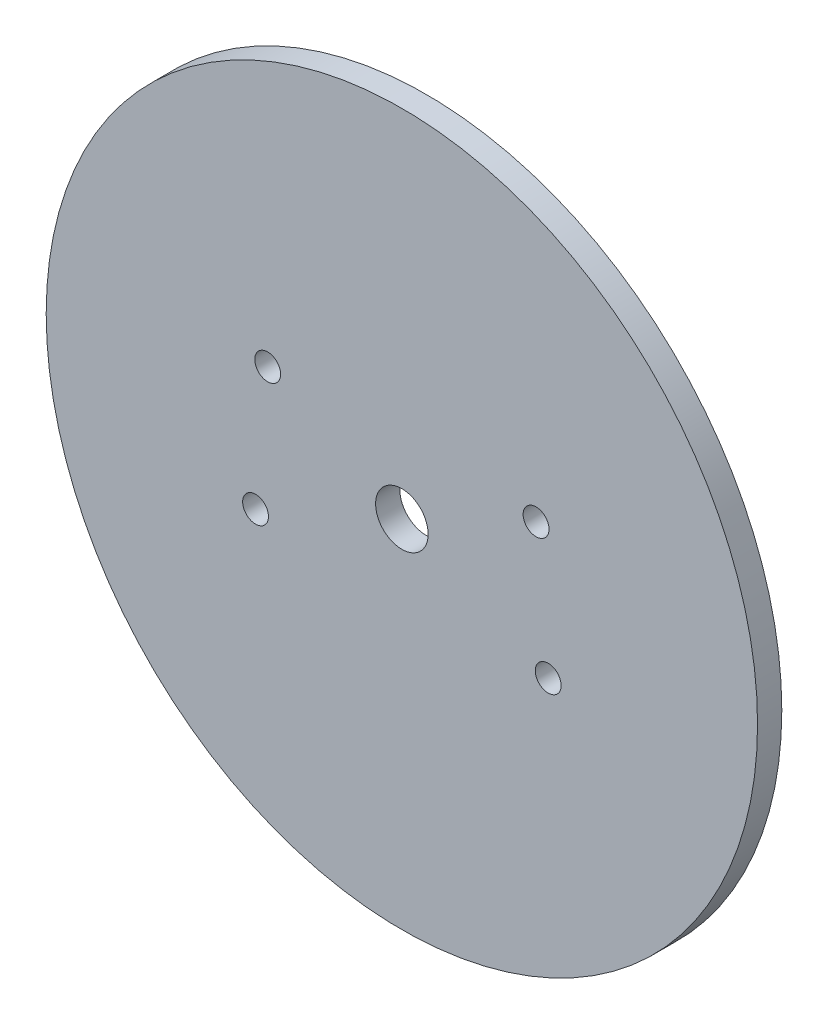
ISO-10303-21;
HEADER;
FILE_DESCRIPTION(('STEP AP214'),'2;1');
FILE_NAME('part.step','',(''),(''),'','','');
FILE_SCHEMA(('AUTOMOTIVE_DESIGN { 1 0 10303 214 1 1 1 1 }'));
ENDSEC;
DATA;
#1=APPLICATION_CONTEXT('core data for automotive mechanical design processes');
#2=APPLICATION_PROTOCOL_DEFINITION('international standard','automotive_design',2000,#1);
#3=PRODUCT_CONTEXT('',#1,'mechanical');
#4=PRODUCT('Part','Part','',(#3));
#5=PRODUCT_RELATED_PRODUCT_CATEGORY('part','',(#4));
#6=PRODUCT_DEFINITION_FORMATION('','',#4);
#7=PRODUCT_DEFINITION_CONTEXT('part definition',#1,'design');
#8=PRODUCT_DEFINITION('design','',#6,#7);
#9=PRODUCT_DEFINITION_SHAPE('','',#8);
#10=(LENGTH_UNIT() NAMED_UNIT(*) SI_UNIT(.MILLI.,.METRE.));
#11=(NAMED_UNIT(*) PLANE_ANGLE_UNIT() SI_UNIT($,.RADIAN.));
#12=(NAMED_UNIT(*) SI_UNIT($,.STERADIAN.) SOLID_ANGLE_UNIT());
#13=UNCERTAINTY_MEASURE_WITH_UNIT(LENGTH_MEASURE(1.E-05),#10,'distance_accuracy_value','');
#14=(GEOMETRIC_REPRESENTATION_CONTEXT(3) GLOBAL_UNCERTAINTY_ASSIGNED_CONTEXT((#13)) GLOBAL_UNIT_ASSIGNED_CONTEXT((#10,
#11,#12)) REPRESENTATION_CONTEXT('',''));
#15=CARTESIAN_POINT('',(0.,0.,0.));
#16=DIRECTION('',(0.,0.,1.));
#17=DIRECTION('',(1.,0.,0.));
#18=AXIS2_PLACEMENT_3D('',#15,#16,#17);
#19=CARTESIAN_POINT('',(0.,0.,3.));
#20=DIRECTION('',(0.,0.,1.));
#21=DIRECTION('',(1.,0.,0.));
#22=AXIS2_PLACEMENT_3D('',#19,#20,#21);
#23=PLANE('',#22);
#24=CARTESIAN_POINT('',(0.,0.,3.));
#25=DIRECTION('',(0.,0.,1.));
#26=DIRECTION('',(1.,0.,0.));
#27=AXIS2_PLACEMENT_3D('',#24,#25,#26);
#28=CIRCLE('',#27,3.25);
#29=CARTESIAN_POINT('',(3.25,0.,3.));
#30=VERTEX_POINT('',#29);
#31=EDGE_CURVE('E75',#30,#30,#28,.T.);
#32=ORIENTED_EDGE('',*,*,#31,.F.);
#33=EDGE_LOOP('',(#32));
#34=FACE_BOUND('',#33,.T.);
#35=CARTESIAN_POINT('',(-16.6,8.,3.));
#36=DIRECTION('',(0.,0.,1.));
#37=DIRECTION('',(1.,0.,0.));
#38=AXIS2_PLACEMENT_3D('',#35,#36,#37);
#39=CIRCLE('',#38,1.6);
#40=CARTESIAN_POINT('',(-15.,8.,3.));
#41=VERTEX_POINT('',#40);
#42=EDGE_CURVE('E55',#41,#41,#39,.T.);
#43=ORIENTED_EDGE('',*,*,#42,.F.);
#44=EDGE_LOOP('',(#43));
#45=FACE_BOUND('',#44,.T.);
#46=CARTESIAN_POINT('',(16.6,8.,3.));
#47=DIRECTION('',(0.,0.,-1.));
#48=DIRECTION('',(-1.,0.,0.));
#49=AXIS2_PLACEMENT_3D('',#46,#47,#48);
#50=CIRCLE('',#49,1.6);
#51=CARTESIAN_POINT('',(15.,8.,3.));
#52=VERTEX_POINT('',#51);
#53=EDGE_CURVE('E62',#52,#52,#50,.T.);
#54=ORIENTED_EDGE('',*,*,#53,.T.);
#55=EDGE_LOOP('',(#54));
#56=FACE_BOUND('',#55,.T.);
#57=CARTESIAN_POINT('',(-18.1,-8.,3.));
#58=DIRECTION('',(0.,0.,1.));
#59=DIRECTION('',(1.,0.,0.));
#60=AXIS2_PLACEMENT_3D('',#57,#58,#59);
#61=CIRCLE('',#60,1.6);
#62=CARTESIAN_POINT('',(-16.5,-8.,3.));
#63=VERTEX_POINT('',#62);
#64=EDGE_CURVE('E52',#63,#63,#61,.T.);
#65=ORIENTED_EDGE('',*,*,#64,.F.);
#66=EDGE_LOOP('',(#65));
#67=FACE_BOUND('',#66,.T.);
#68=CARTESIAN_POINT('',(0.,0.,3.));
#69=DIRECTION('',(0.,0.,1.));
#70=DIRECTION('',(1.,0.,0.));
#71=AXIS2_PLACEMENT_3D('',#68,#69,#70);
#72=CIRCLE('',#71,44.);
#73=CARTESIAN_POINT('',(44.,0.,3.));
#74=VERTEX_POINT('',#73);
#75=EDGE_CURVE('E10',#74,#74,#72,.T.);
#76=ORIENTED_EDGE('',*,*,#75,.T.);
#77=EDGE_LOOP('',(#76));
#78=FACE_BOUND('',#77,.T.);
#79=CARTESIAN_POINT('',(18.1,-8.,3.));
#80=DIRECTION('',(0.,0.,-1.));
#81=DIRECTION('',(-1.,0.,0.));
#82=AXIS2_PLACEMENT_3D('',#79,#80,#81);
#83=CIRCLE('',#82,1.6);
#84=CARTESIAN_POINT('',(16.5,-8.,3.));
#85=VERTEX_POINT('',#84);
#86=EDGE_CURVE('E61',#85,#85,#83,.T.);
#87=ORIENTED_EDGE('',*,*,#86,.T.);
#88=EDGE_LOOP('',(#87));
#89=FACE_BOUND('',#88,.T.);
#90=ADVANCED_FACE('F37',(#34,#45,#56,#67,#78,#89),#23,.T.);
#91=CARTESIAN_POINT('',(0.,0.,0.));
#92=DIRECTION('',(0.,0.,1.));
#93=DIRECTION('',(1.,0.,0.));
#94=AXIS2_PLACEMENT_3D('',#91,#92,#93);
#95=PLANE('',#94);
#96=CARTESIAN_POINT('',(0.,0.,0.));
#97=DIRECTION('',(0.,0.,1.));
#98=DIRECTION('',(1.,0.,0.));
#99=AXIS2_PLACEMENT_3D('',#96,#97,#98);
#100=CIRCLE('',#99,3.25);
#101=CARTESIAN_POINT('',(3.25,0.,0.));
#102=VERTEX_POINT('',#101);
#103=EDGE_CURVE('E41',#102,#102,#100,.T.);
#104=ORIENTED_EDGE('',*,*,#103,.T.);
#105=EDGE_LOOP('',(#104));
#106=FACE_BOUND('',#105,.T.);
#107=CARTESIAN_POINT('',(-16.6,8.,0.));
#108=DIRECTION('',(0.,0.,1.));
#109=DIRECTION('',(1.,0.,0.));
#110=AXIS2_PLACEMENT_3D('',#107,#108,#109);
#111=CIRCLE('',#110,1.6);
#112=CARTESIAN_POINT('',(-15.,8.,0.));
#113=VERTEX_POINT('',#112);
#114=EDGE_CURVE('E65',#113,#113,#111,.T.);
#115=ORIENTED_EDGE('',*,*,#114,.T.);
#116=EDGE_LOOP('',(#115));
#117=FACE_BOUND('',#116,.T.);
#118=CARTESIAN_POINT('',(-18.1,-8.,0.));
#119=DIRECTION('',(0.,0.,1.));
#120=DIRECTION('',(1.,0.,0.));
#121=AXIS2_PLACEMENT_3D('',#118,#119,#120);
#122=CIRCLE('',#121,1.6);
#123=CARTESIAN_POINT('',(-16.5,-8.,0.));
#124=VERTEX_POINT('',#123);
#125=EDGE_CURVE('E50',#124,#124,#122,.T.);
#126=ORIENTED_EDGE('',*,*,#125,.T.);
#127=EDGE_LOOP('',(#126));
#128=FACE_BOUND('',#127,.T.);
#129=CARTESIAN_POINT('',(0.,0.,0.));
#130=DIRECTION('',(0.,0.,1.));
#131=DIRECTION('',(1.,0.,0.));
#132=AXIS2_PLACEMENT_3D('',#129,#130,#131);
#133=CIRCLE('',#132,44.);
#134=CARTESIAN_POINT('',(44.,0.,0.));
#135=VERTEX_POINT('',#134);
#136=EDGE_CURVE('E45',#135,#135,#133,.T.);
#137=ORIENTED_EDGE('',*,*,#136,.F.);
#138=EDGE_LOOP('',(#137));
#139=FACE_BOUND('',#138,.T.);
#140=CARTESIAN_POINT('',(16.6,8.,0.));
#141=DIRECTION('',(0.,0.,-1.));
#142=DIRECTION('',(-1.,0.,0.));
#143=AXIS2_PLACEMENT_3D('',#140,#141,#142);
#144=CIRCLE('',#143,1.6);
#145=CARTESIAN_POINT('',(15.,8.,0.));
#146=VERTEX_POINT('',#145);
#147=EDGE_CURVE('E70',#146,#146,#144,.T.);
#148=ORIENTED_EDGE('',*,*,#147,.F.);
#149=EDGE_LOOP('',(#148));
#150=FACE_BOUND('',#149,.T.);
#151=CARTESIAN_POINT('',(18.1,-8.,0.));
#152=DIRECTION('',(0.,0.,-1.));
#153=DIRECTION('',(-1.,0.,0.));
#154=AXIS2_PLACEMENT_3D('',#151,#152,#153);
#155=CIRCLE('',#154,1.6);
#156=CARTESIAN_POINT('',(16.5,-8.,0.));
#157=VERTEX_POINT('',#156);
#158=EDGE_CURVE('E58',#157,#157,#155,.T.);
#159=ORIENTED_EDGE('',*,*,#158,.F.);
#160=EDGE_LOOP('',(#159));
#161=FACE_BOUND('',#160,.T.);
#162=ADVANCED_FACE('F82',(#106,#117,#128,#139,#150,#161),#95,.F.);
#163=CARTESIAN_POINT('',(0.,0.,3.));
#164=DIRECTION('',(0.,0.,-1.));
#165=DIRECTION('',(-1.,0.,0.));
#166=AXIS2_PLACEMENT_3D('',#163,#164,#165);
#167=CYLINDRICAL_SURFACE('',#166,44.);
#168=ORIENTED_EDGE('',*,*,#75,.F.);
#169=EDGE_LOOP('',(#168));
#170=FACE_BOUND('',#169,.T.);
#171=ORIENTED_EDGE('',*,*,#136,.T.);
#172=EDGE_LOOP('',(#171));
#173=FACE_BOUND('',#172,.T.);
#174=ADVANCED_FACE('F39',(#170,#173),#167,.T.);
#175=CARTESIAN_POINT('',(-18.1,-8.,0.));
#176=DIRECTION('',(0.,0.,1.));
#177=DIRECTION('',(1.,0.,0.));
#178=AXIS2_PLACEMENT_3D('',#175,#176,#177);
#179=CYLINDRICAL_SURFACE('',#178,1.6);
#180=ORIENTED_EDGE('',*,*,#125,.F.);
#181=EDGE_LOOP('',(#180));
#182=FACE_BOUND('',#181,.T.);
#183=ORIENTED_EDGE('',*,*,#64,.T.);
#184=EDGE_LOOP('',(#183));
#185=FACE_BOUND('',#184,.T.);
#186=ADVANCED_FACE('F104',(#182,#185),#179,.F.);
#187=CARTESIAN_POINT('',(16.6,8.,0.));
#188=DIRECTION('',(0.,0.,1.));
#189=DIRECTION('',(1.,0.,0.));
#190=AXIS2_PLACEMENT_3D('',#187,#188,#189);
#191=CYLINDRICAL_SURFACE('',#190,1.6);
#192=ORIENTED_EDGE('',*,*,#147,.T.);
#193=EDGE_LOOP('',(#192));
#194=FACE_BOUND('',#193,.T.);
#195=ORIENTED_EDGE('',*,*,#53,.F.);
#196=EDGE_LOOP('',(#195));
#197=FACE_BOUND('',#196,.T.);
#198=ADVANCED_FACE('F107',(#194,#197),#191,.F.);
#199=CARTESIAN_POINT('',(18.1,-8.,0.));
#200=DIRECTION('',(0.,0.,1.));
#201=DIRECTION('',(1.,0.,0.));
#202=AXIS2_PLACEMENT_3D('',#199,#200,#201);
#203=CYLINDRICAL_SURFACE('',#202,1.6);
#204=ORIENTED_EDGE('',*,*,#158,.T.);
#205=EDGE_LOOP('',(#204));
#206=FACE_BOUND('',#205,.T.);
#207=ORIENTED_EDGE('',*,*,#86,.F.);
#208=EDGE_LOOP('',(#207));
#209=FACE_BOUND('',#208,.T.);
#210=ADVANCED_FACE('F93',(#206,#209),#203,.F.);
#211=CARTESIAN_POINT('',(-16.6,8.,0.));
#212=DIRECTION('',(0.,0.,1.));
#213=DIRECTION('',(1.,0.,0.));
#214=AXIS2_PLACEMENT_3D('',#211,#212,#213);
#215=CYLINDRICAL_SURFACE('',#214,1.6);
#216=ORIENTED_EDGE('',*,*,#114,.F.);
#217=EDGE_LOOP('',(#216));
#218=FACE_BOUND('',#217,.T.);
#219=ORIENTED_EDGE('',*,*,#42,.T.);
#220=EDGE_LOOP('',(#219));
#221=FACE_BOUND('',#220,.T.);
#222=ADVANCED_FACE('F87',(#218,#221),#215,.F.);
#223=CARTESIAN_POINT('',(0.,0.,-32.));
#224=DIRECTION('',(0.,0.,1.));
#225=DIRECTION('',(1.,0.,0.));
#226=AXIS2_PLACEMENT_3D('',#223,#224,#225);
#227=CYLINDRICAL_SURFACE('',#226,3.25);
#228=ORIENTED_EDGE('',*,*,#31,.T.);
#229=EDGE_LOOP('',(#228));
#230=FACE_BOUND('',#229,.T.);
#231=ORIENTED_EDGE('',*,*,#103,.F.);
#232=EDGE_LOOP('',(#231));
#233=FACE_BOUND('',#232,.T.);
#234=ADVANCED_FACE('F85',(#230,#233),#227,.F.);
#235=CLOSED_SHELL('',(#90,#162,#174,#186,#198,#210,#222,#234));
#236=MANIFOLD_SOLID_BREP('B2',#235);
#237=ADVANCED_BREP_SHAPE_REPRESENTATION('',(#18,#236),#14);
#238=SHAPE_DEFINITION_REPRESENTATION(#9,#237);
ENDSEC;
END-ISO-10303-21;
